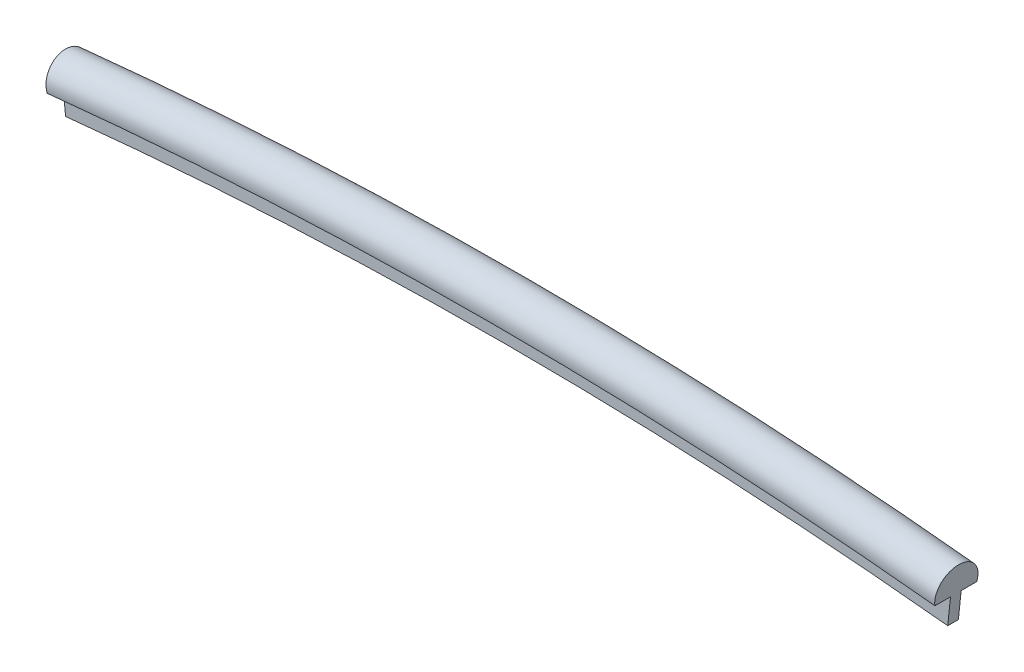
ISO-10303-21;
HEADER;
FILE_DESCRIPTION(('STEP AP214'),'2;1');
FILE_NAME('part.step','',(''),(''),'','','');
FILE_SCHEMA(('AUTOMOTIVE_DESIGN { 1 0 10303 214 1 1 1 1 }'));
ENDSEC;
DATA;
#1=APPLICATION_CONTEXT('core data for automotive mechanical design processes');
#2=APPLICATION_PROTOCOL_DEFINITION('international standard','automotive_design',2000,#1);
#3=PRODUCT_CONTEXT('',#1,'mechanical');
#4=PRODUCT('Part','Part','',(#3));
#5=PRODUCT_RELATED_PRODUCT_CATEGORY('part','',(#4));
#6=PRODUCT_DEFINITION_FORMATION('','',#4);
#7=PRODUCT_DEFINITION_CONTEXT('part definition',#1,'design');
#8=PRODUCT_DEFINITION('design','',#6,#7);
#9=PRODUCT_DEFINITION_SHAPE('','',#8);
#10=(LENGTH_UNIT() NAMED_UNIT(*) SI_UNIT(.MILLI.,.METRE.));
#11=(NAMED_UNIT(*) PLANE_ANGLE_UNIT() SI_UNIT($,.RADIAN.));
#12=(NAMED_UNIT(*) SI_UNIT($,.STERADIAN.) SOLID_ANGLE_UNIT());
#13=UNCERTAINTY_MEASURE_WITH_UNIT(LENGTH_MEASURE(1.E-05),#10,'distance_accuracy_value','');
#14=(GEOMETRIC_REPRESENTATION_CONTEXT(3) GLOBAL_UNCERTAINTY_ASSIGNED_CONTEXT((#13)) GLOBAL_UNIT_ASSIGNED_CONTEXT((#10,
#11,#12)) REPRESENTATION_CONTEXT('',''));
#15=CARTESIAN_POINT('',(0.,0.,0.));
#16=DIRECTION('',(0.,0.,1.));
#17=DIRECTION('',(1.,0.,0.));
#18=AXIS2_PLACEMENT_3D('',#15,#16,#17);
#19=CARTESIAN_POINT('',(0.,0.,70.5976415970385));
#20=DIRECTION('',(0.,0.,1.));
#21=DIRECTION('',(1.,0.,0.));
#22=AXIS2_PLACEMENT_3D('',#19,#20,#21);
#23=CYLINDRICAL_SURFACE('',#22,241.3);
#24=CARTESIAN_POINT('',(0.,0.,1.18));
#25=DIRECTION('',(0.,0.,1.));
#26=DIRECTION('',(1.,0.,0.));
#27=AXIS2_PLACEMENT_3D('',#24,#25,#26);
#28=CIRCLE('',#27,241.3);
#29=CARTESIAN_POINT('',(25.0100240841208,240.000393114911,1.18));
#30=VERTEX_POINT('',#29);
#31=CARTESIAN_POINT('',(-25.0100240841208,240.000393114911,1.18));
#32=VERTEX_POINT('',#31);
#33=EDGE_CURVE('E11',#30,#32,#28,.T.);
#34=ORIENTED_EDGE('',*,*,#33,.T.);
#35=DIRECTION('',(0.,0.,-1.));
#36=VECTOR('',#35,1.);
#37=CARTESIAN_POINT('',(-25.0100240841208,240.000393114911,1.18));
#38=LINE('',#37,#36);
#39=CARTESIAN_POINT('',(-25.0100240841208,240.000393114911,0.3));
#40=VERTEX_POINT('',#39);
#41=EDGE_CURVE('E103',#32,#40,#38,.T.);
#42=ORIENTED_EDGE('',*,*,#41,.T.);
#43=CARTESIAN_POINT('',(0.,0.,0.299999999999995));
#44=DIRECTION('',(0.,0.,1.));
#45=DIRECTION('',(1.,0.,0.));
#46=AXIS2_PLACEMENT_3D('',#43,#44,#45);
#47=CIRCLE('',#46,241.3);
#48=CARTESIAN_POINT('',(25.0100240841208,240.000393114911,0.3));
#49=VERTEX_POINT('',#48);
#50=EDGE_CURVE('E85',#49,#40,#47,.T.);
#51=ORIENTED_EDGE('',*,*,#50,.F.);
#52=DIRECTION('',(0.,0.,-1.));
#53=VECTOR('',#52,1.);
#54=CARTESIAN_POINT('',(25.0100240841208,240.000393114911,1.18));
#55=LINE('',#54,#53);
#56=EDGE_CURVE('E117',#30,#49,#55,.T.);
#57=ORIENTED_EDGE('',*,*,#56,.F.);
#58=EDGE_LOOP('',(#34,#42,#51,#57));
#59=FACE_BOUND('',#58,.T.);
#60=ADVANCED_FACE('F33',(#59),#23,.F.);
#61=CARTESIAN_POINT('',(0.,0.,0.));
#62=DIRECTION('',(0.,0.,1.));
#63=DIRECTION('',(1.,0.,0.));
#64=AXIS2_PLACEMENT_3D('',#61,#62,#63);
#65=TOROIDAL_SURFACE('',#64,241.586013989906,1.21416802890791);
#66=CARTESIAN_POINT('',(0.,0.,-1.18));
#67=DIRECTION('',(0.,0.,1.));
#68=DIRECTION('',(1.,0.,0.));
#69=AXIS2_PLACEMENT_3D('',#66,#67,#68);
#70=CIRCLE('',#69,241.3);
#71=CARTESIAN_POINT('',(25.0100240841208,240.000393114911,-1.18));
#72=VERTEX_POINT('',#71);
#73=CARTESIAN_POINT('',(-25.0100240841208,240.000393114911,-1.18));
#74=VERTEX_POINT('',#73);
#75=EDGE_CURVE('E41',#72,#74,#70,.T.);
#76=ORIENTED_EDGE('',*,*,#75,.T.);
#77=CARTESIAN_POINT('',(-25.0396685796697,240.284866674852,0.));
#78=DIRECTION('',(0.99461414469503,0.10364701236685,0.));
#79=DIRECTION('',(0.,0.,1.));
#80=AXIS2_PLACEMENT_3D('',#77,#78,#79);
#81=CIRCLE('',#80,1.21416802890791);
#82=EDGE_CURVE('E115',#74,#32,#81,.T.);
#83=ORIENTED_EDGE('',*,*,#82,.T.);
#84=ORIENTED_EDGE('',*,*,#33,.F.);
#85=CARTESIAN_POINT('',(25.0396685796697,240.284866674852,0.));
#86=DIRECTION('',(0.99461414469503,-0.10364701236685,0.));
#87=DIRECTION('',(0.,0.,1.));
#88=AXIS2_PLACEMENT_3D('',#85,#86,#87);
#89=CIRCLE('',#88,1.21416802890791);
#90=EDGE_CURVE('E97',#72,#30,#89,.T.);
#91=ORIENTED_EDGE('',*,*,#90,.F.);
#92=EDGE_LOOP('',(#76,#83,#84,#91));
#93=FACE_BOUND('',#92,.T.);
#94=ADVANCED_FACE('F35',(#93),#65,.T.);
#95=CARTESIAN_POINT('',(0.,0.,70.5976415970385));
#96=DIRECTION('',(0.,0.,1.));
#97=DIRECTION('',(1.,0.,0.));
#98=AXIS2_PLACEMENT_3D('',#95,#96,#97);
#99=CYLINDRICAL_SURFACE('',#98,241.3);
#100=CARTESIAN_POINT('',(0.,0.,-0.299999999999995));
#101=DIRECTION('',(0.,0.,1.));
#102=DIRECTION('',(1.,0.,0.));
#103=AXIS2_PLACEMENT_3D('',#100,#101,#102);
#104=CIRCLE('',#103,241.3);
#105=CARTESIAN_POINT('',(25.0100240841208,240.000393114911,-0.3));
#106=VERTEX_POINT('',#105);
#107=CARTESIAN_POINT('',(-25.0100240841208,240.000393114911,-0.3));
#108=VERTEX_POINT('',#107);
#109=EDGE_CURVE('E132',#106,#108,#104,.T.);
#110=ORIENTED_EDGE('',*,*,#109,.T.);
#111=DIRECTION('',(0.,0.,-1.));
#112=VECTOR('',#111,1.);
#113=CARTESIAN_POINT('',(-25.0100240841208,240.000393114911,-0.3));
#114=LINE('',#113,#112);
#115=EDGE_CURVE('E113',#108,#74,#114,.T.);
#116=ORIENTED_EDGE('',*,*,#115,.T.);
#117=ORIENTED_EDGE('',*,*,#75,.F.);
#118=DIRECTION('',(0.,0.,-1.));
#119=VECTOR('',#118,1.);
#120=CARTESIAN_POINT('',(25.0100240841208,240.000393114911,-0.3));
#121=LINE('',#120,#119);
#122=EDGE_CURVE('E125',#106,#72,#121,.T.);
#123=ORIENTED_EDGE('',*,*,#122,.F.);
#124=EDGE_LOOP('',(#110,#116,#117,#123));
#125=FACE_BOUND('',#124,.T.);
#126=ADVANCED_FACE('F134',(#125),#99,.F.);
#127=CARTESIAN_POINT('',(24.8545535655705,238.508471897868,-0.3));
#128=DIRECTION('',(0.,0.,1.));
#129=DIRECTION('',(1.,0.,0.));
#130=AXIS2_PLACEMENT_3D('',#127,#128,#129);
#131=PLANE('',#130);
#132=CARTESIAN_POINT('',(0.,0.,-0.299999999999995));
#133=DIRECTION('',(0.,0.,1.));
#134=DIRECTION('',(1.,0.,0.));
#135=AXIS2_PLACEMENT_3D('',#132,#133,#134);
#136=CIRCLE('',#135,239.8);
#137=CARTESIAN_POINT('',(24.8545535655705,238.508471897868,-0.3));
#138=VERTEX_POINT('',#137);
#139=CARTESIAN_POINT('',(-24.8545535655705,238.508471897868,-0.3));
#140=VERTEX_POINT('',#139);
#141=EDGE_CURVE('E129',#138,#140,#136,.T.);
#142=ORIENTED_EDGE('',*,*,#141,.T.);
#143=DIRECTION('',(-0.10364701236685,0.99461414469503,0.));
#144=VECTOR('',#143,1.);
#145=CARTESIAN_POINT('',(-24.8545535655705,238.508471897868,-0.3));
#146=LINE('',#145,#144);
#147=EDGE_CURVE('E110',#140,#108,#146,.T.);
#148=ORIENTED_EDGE('',*,*,#147,.T.);
#149=ORIENTED_EDGE('',*,*,#109,.F.);
#150=DIRECTION('',(0.10364701236685,0.99461414469503,0.));
#151=VECTOR('',#150,1.);
#152=CARTESIAN_POINT('',(24.8545535655705,238.508471897868,-0.3));
#153=LINE('',#152,#151);
#154=EDGE_CURVE('E122',#138,#106,#153,.T.);
#155=ORIENTED_EDGE('',*,*,#154,.F.);
#156=EDGE_LOOP('',(#142,#148,#149,#155));
#157=FACE_BOUND('',#156,.T.);
#158=ADVANCED_FACE('F136',(#157),#131,.F.);
#159=CARTESIAN_POINT('',(0.,0.,70.5976415970385));
#160=DIRECTION('',(0.,0.,1.));
#161=DIRECTION('',(1.,0.,0.));
#162=AXIS2_PLACEMENT_3D('',#159,#160,#161);
#163=CYLINDRICAL_SURFACE('',#162,239.8);
#164=CARTESIAN_POINT('',(0.,0.,0.299999999999995));
#165=DIRECTION('',(0.,0.,1.));
#166=DIRECTION('',(1.,0.,0.));
#167=AXIS2_PLACEMENT_3D('',#164,#165,#166);
#168=CIRCLE('',#167,239.8);
#169=CARTESIAN_POINT('',(24.8545535655705,238.508471897868,0.3));
#170=VERTEX_POINT('',#169);
#171=CARTESIAN_POINT('',(-24.8545535655705,238.508471897868,0.3));
#172=VERTEX_POINT('',#171);
#173=EDGE_CURVE('E96',#170,#172,#168,.T.);
#174=ORIENTED_EDGE('',*,*,#173,.T.);
#175=DIRECTION('',(0.,0.,-1.));
#176=VECTOR('',#175,1.);
#177=CARTESIAN_POINT('',(-24.8545535655705,238.508471897868,0.));
#178=LINE('',#177,#176);
#179=EDGE_CURVE('E105',#172,#140,#178,.T.);
#180=ORIENTED_EDGE('',*,*,#179,.T.);
#181=ORIENTED_EDGE('',*,*,#141,.F.);
#182=DIRECTION('',(0.,0.,-1.));
#183=VECTOR('',#182,1.);
#184=CARTESIAN_POINT('',(24.8545535655705,238.508471897868,0.));
#185=LINE('',#184,#183);
#186=EDGE_CURVE('E120',#170,#138,#185,.T.);
#187=ORIENTED_EDGE('',*,*,#186,.F.);
#188=EDGE_LOOP('',(#174,#180,#181,#187));
#189=FACE_BOUND('',#188,.T.);
#190=ADVANCED_FACE('F141',(#189),#163,.F.);
#191=CARTESIAN_POINT('',(24.8545535655705,238.508471897868,0.3));
#192=DIRECTION('',(0.,0.,-1.));
#193=DIRECTION('',(-1.,0.,0.));
#194=AXIS2_PLACEMENT_3D('',#191,#192,#193);
#195=PLANE('',#194);
#196=DIRECTION('',(-0.10364701236685,-0.99461414469503,0.));
#197=VECTOR('',#196,1.);
#198=CARTESIAN_POINT('',(24.8545535655705,238.508471897868,0.3));
#199=LINE('',#198,#197);
#200=EDGE_CURVE('E91',#49,#170,#199,.T.);
#201=ORIENTED_EDGE('',*,*,#200,.F.);
#202=ORIENTED_EDGE('',*,*,#50,.T.);
#203=DIRECTION('',(0.10364701236685,-0.99461414469503,0.));
#204=VECTOR('',#203,1.);
#205=CARTESIAN_POINT('',(-24.8545535655705,238.508471897868,0.3));
#206=LINE('',#205,#204);
#207=EDGE_CURVE('E88',#40,#172,#206,.T.);
#208=ORIENTED_EDGE('',*,*,#207,.T.);
#209=ORIENTED_EDGE('',*,*,#173,.F.);
#210=EDGE_LOOP('',(#201,#202,#208,#209));
#211=FACE_BOUND('',#210,.T.);
#212=ADVANCED_FACE('F87',(#211),#195,.F.);
#213=CARTESIAN_POINT('',(25.0396685796697,240.284866674852,0.));
#214=DIRECTION('',(-0.99461414469503,0.10364701236685,0.));
#215=DIRECTION('',(0.,0.,1.));
#216=AXIS2_PLACEMENT_3D('',#213,#214,#215);
#217=PLANE('',#216);
#218=ORIENTED_EDGE('',*,*,#56,.T.);
#219=ORIENTED_EDGE('',*,*,#200,.T.);
#220=ORIENTED_EDGE('',*,*,#186,.T.);
#221=ORIENTED_EDGE('',*,*,#154,.T.);
#222=ORIENTED_EDGE('',*,*,#122,.T.);
#223=ORIENTED_EDGE('',*,*,#90,.T.);
#224=EDGE_LOOP('',(#218,#219,#220,#221,#222,#223));
#225=FACE_BOUND('',#224,.T.);
#226=ADVANCED_FACE('F143',(#225),#217,.F.);
#227=CARTESIAN_POINT('',(-25.0396685796697,240.284866674852,0.));
#228=DIRECTION('',(-0.99461414469503,-0.10364701236685,0.));
#229=DIRECTION('',(0.,0.,1.));
#230=AXIS2_PLACEMENT_3D('',#227,#228,#229);
#231=PLANE('',#230);
#232=ORIENTED_EDGE('',*,*,#41,.F.);
#233=ORIENTED_EDGE('',*,*,#82,.F.);
#234=ORIENTED_EDGE('',*,*,#115,.F.);
#235=ORIENTED_EDGE('',*,*,#147,.F.);
#236=ORIENTED_EDGE('',*,*,#179,.F.);
#237=ORIENTED_EDGE('',*,*,#207,.F.);
#238=EDGE_LOOP('',(#232,#233,#234,#235,#236,#237));
#239=FACE_BOUND('',#238,.T.);
#240=ADVANCED_FACE('F101',(#239),#231,.T.);
#241=CLOSED_SHELL('',(#60,#94,#126,#158,#190,#212,#226,#240));
#242=MANIFOLD_SOLID_BREP('B2',#241);
#243=ADVANCED_BREP_SHAPE_REPRESENTATION('',(#18,#242),#14);
#244=SHAPE_DEFINITION_REPRESENTATION(#9,#243);
ENDSEC;
END-ISO-10303-21;
